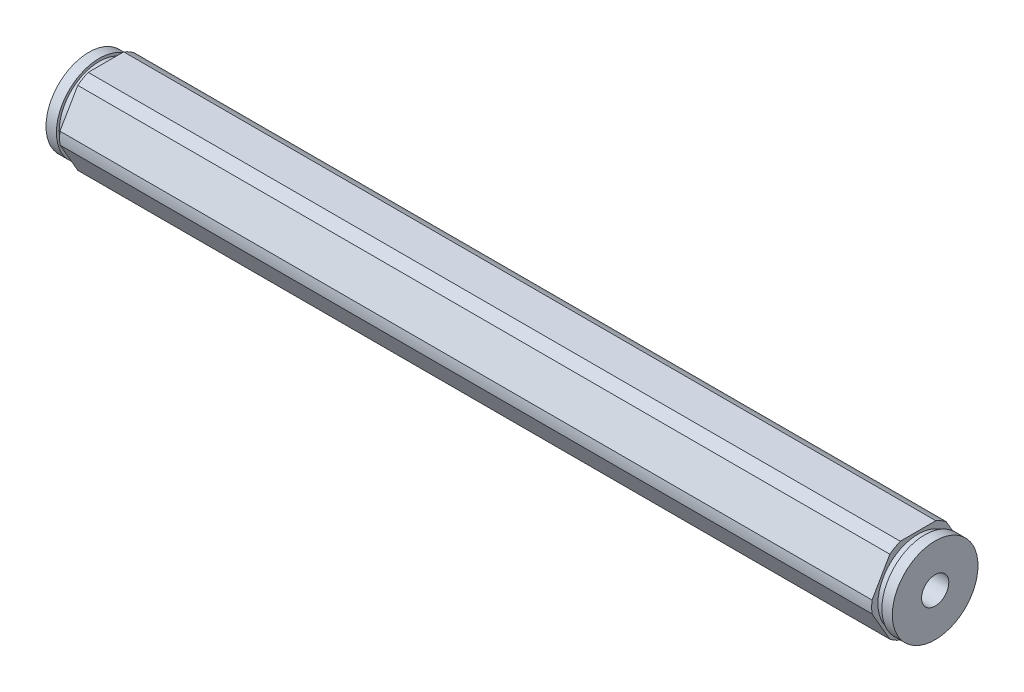
ISO-10303-21;
HEADER;
FILE_DESCRIPTION(('STEP AP214'),'2;1');
FILE_NAME('part.step','',(''),(''),'','','');
FILE_SCHEMA(('AUTOMOTIVE_DESIGN { 1 0 10303 214 1 1 1 1 }'));
ENDSEC;
DATA;
#1=APPLICATION_CONTEXT('core data for automotive mechanical design processes');
#2=APPLICATION_PROTOCOL_DEFINITION('international standard','automotive_design',2000,#1);
#3=PRODUCT_CONTEXT('',#1,'mechanical');
#4=PRODUCT('Part','Part','',(#3));
#5=PRODUCT_RELATED_PRODUCT_CATEGORY('part','',(#4));
#6=PRODUCT_DEFINITION_FORMATION('','',#4);
#7=PRODUCT_DEFINITION_CONTEXT('part definition',#1,'design');
#8=PRODUCT_DEFINITION('design','',#6,#7);
#9=PRODUCT_DEFINITION_SHAPE('','',#8);
#10=(LENGTH_UNIT() NAMED_UNIT(*) SI_UNIT(.MILLI.,.METRE.));
#11=(NAMED_UNIT(*) PLANE_ANGLE_UNIT() SI_UNIT($,.RADIAN.));
#12=(NAMED_UNIT(*) SI_UNIT($,.STERADIAN.) SOLID_ANGLE_UNIT());
#13=UNCERTAINTY_MEASURE_WITH_UNIT(LENGTH_MEASURE(1.E-05),#10,'distance_accuracy_value','');
#14=(GEOMETRIC_REPRESENTATION_CONTEXT(3) GLOBAL_UNCERTAINTY_ASSIGNED_CONTEXT((#13)) GLOBAL_UNIT_ASSIGNED_CONTEXT((#10,
#11,#12)) REPRESENTATION_CONTEXT('',''));
#15=CARTESIAN_POINT('',(0.,0.,0.));
#16=DIRECTION('',(0.,0.,1.));
#17=DIRECTION('',(1.,0.,0.));
#18=AXIS2_PLACEMENT_3D('',#15,#16,#17);
#19=CARTESIAN_POINT('',(62.738,-6.35,-3.66617420935412));
#20=DIRECTION('',(0.,0.5,0.866025403784439));
#21=DIRECTION('',(0.,-0.866025403784439,0.5));
#22=AXIS2_PLACEMENT_3D('',#19,#20,#21);
#23=PLANE('',#22);
#24=DIRECTION('',(1.,0.,0.));
#25=VECTOR('',#24,1.);
#26=CARTESIAN_POINT('',(-62.738,-5.45696050579321,-4.18177080173138));
#27=LINE('',#26,#25);
#28=CARTESIAN_POINT('',(-60.198,-5.45696050579321,-4.18177080173138));
#29=VERTEX_POINT('',#28);
#30=CARTESIAN_POINT('',(60.198,-5.45696050579321,-4.18177080173138));
#31=VERTEX_POINT('',#30);
#32=EDGE_CURVE('E254',#29,#31,#27,.T.);
#33=ORIENTED_EDGE('',*,*,#32,.F.);
#34=DIRECTION('',(0.,0.866025403784439,-0.5));
#35=VECTOR('',#34,1.);
#36=CARTESIAN_POINT('',(-60.198,-6.35,-3.66617420935412));
#37=LINE('',#36,#35);
#38=CARTESIAN_POINT('',(-60.198,-0.893039494206789,-6.81675182633099));
#39=VERTEX_POINT('',#38);
#40=EDGE_CURVE('E151',#29,#39,#37,.T.);
#41=ORIENTED_EDGE('',*,*,#40,.T.);
#42=DIRECTION('',(1.,0.,0.));
#43=VECTOR('',#42,1.);
#44=CARTESIAN_POINT('',(-62.738,-0.89303949420679,-6.81675182633099));
#45=LINE('',#44,#43);
#46=CARTESIAN_POINT('',(60.198,-0.89303949420679,-6.81675182633099));
#47=VERTEX_POINT('',#46);
#48=EDGE_CURVE('E60',#47,#39,#45,.F.);
#49=ORIENTED_EDGE('',*,*,#48,.F.);
#50=DIRECTION('',(0.,-0.866025403784439,0.5));
#51=VECTOR('',#50,1.);
#52=CARTESIAN_POINT('',(60.198,-6.35,-3.66617420935412));
#53=LINE('',#52,#51);
#54=EDGE_CURVE('E179',#47,#31,#53,.T.);
#55=ORIENTED_EDGE('',*,*,#54,.T.);
#56=EDGE_LOOP('',(#33,#41,#49,#55));
#57=FACE_BOUND('',#56,.T.);
#58=ADVANCED_FACE('F45',(#57),#23,.F.);
#59=CARTESIAN_POINT('',(62.738,0.,-7.33234841870825));
#60=DIRECTION('',(0.,-0.5,0.866025403784439));
#61=DIRECTION('',(0.,-0.866025403784439,-0.5));
#62=AXIS2_PLACEMENT_3D('',#59,#60,#61);
#63=PLANE('',#62);
#64=DIRECTION('',(1.,0.,0.));
#65=VECTOR('',#64,1.);
#66=CARTESIAN_POINT('',(-62.738,0.893039494206789,-6.81675182633099));
#67=LINE('',#66,#65);
#68=CARTESIAN_POINT('',(-60.198,0.893039494206789,-6.81675182633099));
#69=VERTEX_POINT('',#68);
#70=CARTESIAN_POINT('',(60.198,0.893039494206789,-6.81675182633099));
#71=VERTEX_POINT('',#70);
#72=EDGE_CURVE('E132',#69,#71,#67,.T.);
#73=ORIENTED_EDGE('',*,*,#72,.F.);
#74=DIRECTION('',(0.,0.866025403784439,0.5));
#75=VECTOR('',#74,1.);
#76=CARTESIAN_POINT('',(-60.198,0.,-7.33234841870825));
#77=LINE('',#76,#75);
#78=CARTESIAN_POINT('',(-60.198,5.45696050579321,-4.18177080173138));
#79=VERTEX_POINT('',#78);
#80=EDGE_CURVE('E144',#69,#79,#77,.T.);
#81=ORIENTED_EDGE('',*,*,#80,.T.);
#82=DIRECTION('',(1.,0.,0.));
#83=VECTOR('',#82,1.);
#84=CARTESIAN_POINT('',(-62.738,5.45696050579321,-4.18177080173138));
#85=LINE('',#84,#83);
#86=CARTESIAN_POINT('',(60.198,5.45696050579321,-4.18177080173138));
#87=VERTEX_POINT('',#86);
#88=EDGE_CURVE('E67',#87,#79,#85,.F.);
#89=ORIENTED_EDGE('',*,*,#88,.F.);
#90=DIRECTION('',(0.,-0.866025403784439,-0.5));
#91=VECTOR('',#90,1.);
#92=CARTESIAN_POINT('',(60.198,0.,-7.33234841870825));
#93=LINE('',#92,#91);
#94=EDGE_CURVE('E146',#87,#71,#93,.T.);
#95=ORIENTED_EDGE('',*,*,#94,.T.);
#96=EDGE_LOOP('',(#73,#81,#89,#95));
#97=FACE_BOUND('',#96,.T.);
#98=ADVANCED_FACE('F143',(#97),#63,.F.);
#99=CARTESIAN_POINT('',(62.738,6.35,-3.66617420935412));
#100=DIRECTION('',(0.,-1.,0.));
#101=DIRECTION('',(0.,0.,-1.));
#102=AXIS2_PLACEMENT_3D('',#99,#100,#101);
#103=PLANE('',#102);
#104=DIRECTION('',(1.,0.,0.));
#105=VECTOR('',#104,1.);
#106=CARTESIAN_POINT('',(-62.738,6.35,-2.63498102459961));
#107=LINE('',#106,#105);
#108=CARTESIAN_POINT('',(-60.198,6.35,-2.63498102459961));
#109=VERTEX_POINT('',#108);
#110=CARTESIAN_POINT('',(60.198,6.35,-2.63498102459961));
#111=VERTEX_POINT('',#110);
#112=EDGE_CURVE('E241',#109,#111,#107,.T.);
#113=ORIENTED_EDGE('',*,*,#112,.F.);
#114=DIRECTION('',(0.,0.,1.));
#115=VECTOR('',#114,1.);
#116=CARTESIAN_POINT('',(-60.198,6.35,-3.66617420935412));
#117=LINE('',#116,#115);
#118=CARTESIAN_POINT('',(-60.198,6.35,2.63498102459961));
#119=VERTEX_POINT('',#118);
#120=EDGE_CURVE('E152',#109,#119,#117,.T.);
#121=ORIENTED_EDGE('',*,*,#120,.T.);
#122=DIRECTION('',(1.,0.,0.));
#123=VECTOR('',#122,1.);
#124=CARTESIAN_POINT('',(-62.738,6.35,2.63498102459961));
#125=LINE('',#124,#123);
#126=CARTESIAN_POINT('',(60.198,6.35,2.63498102459961));
#127=VERTEX_POINT('',#126);
#128=EDGE_CURVE('E218',#127,#119,#125,.F.);
#129=ORIENTED_EDGE('',*,*,#128,.F.);
#130=DIRECTION('',(0.,0.,-1.));
#131=VECTOR('',#130,1.);
#132=CARTESIAN_POINT('',(60.198,6.35,-3.66617420935412));
#133=LINE('',#132,#131);
#134=EDGE_CURVE('E175',#127,#111,#133,.T.);
#135=ORIENTED_EDGE('',*,*,#134,.T.);
#136=EDGE_LOOP('',(#113,#121,#129,#135));
#137=FACE_BOUND('',#136,.T.);
#138=ADVANCED_FACE('F304',(#137),#103,.F.);
#139=CARTESIAN_POINT('',(62.738,6.35,3.66617420935412));
#140=DIRECTION('',(0.,-0.5,-0.866025403784439));
#141=DIRECTION('',(0.,0.866025403784439,-0.5));
#142=AXIS2_PLACEMENT_3D('',#139,#140,#141);
#143=PLANE('',#142);
#144=DIRECTION('',(1.,0.,0.));
#145=VECTOR('',#144,1.);
#146=CARTESIAN_POINT('',(-62.738,5.45696050579321,4.18177080173138));
#147=LINE('',#146,#145);
#148=CARTESIAN_POINT('',(-60.198,5.45696050579321,4.18177080173138));
#149=VERTEX_POINT('',#148);
#150=CARTESIAN_POINT('',(60.198,5.45696050579321,4.18177080173138));
#151=VERTEX_POINT('',#150);
#152=EDGE_CURVE('E215',#149,#151,#147,.T.);
#153=ORIENTED_EDGE('',*,*,#152,.F.);
#154=DIRECTION('',(0.,-0.866025403784439,0.5));
#155=VECTOR('',#154,1.);
#156=CARTESIAN_POINT('',(-60.198,6.35,3.66617420935412));
#157=LINE('',#156,#155);
#158=CARTESIAN_POINT('',(-60.198,0.893039494206796,6.81675182633099));
#159=VERTEX_POINT('',#158);
#160=EDGE_CURVE('E157',#149,#159,#157,.T.);
#161=ORIENTED_EDGE('',*,*,#160,.T.);
#162=DIRECTION('',(1.,0.,0.));
#163=VECTOR('',#162,1.);
#164=CARTESIAN_POINT('',(-62.738,0.893039494206798,6.81675182633099));
#165=LINE('',#164,#163);
#166=CARTESIAN_POINT('',(60.198,0.893039494206798,6.81675182633099));
#167=VERTEX_POINT('',#166);
#168=EDGE_CURVE('E245',#167,#159,#165,.F.);
#169=ORIENTED_EDGE('',*,*,#168,.F.);
#170=DIRECTION('',(0.,0.866025403784439,-0.5));
#171=VECTOR('',#170,1.);
#172=CARTESIAN_POINT('',(60.198,6.35,3.66617420935412));
#173=LINE('',#172,#171);
#174=EDGE_CURVE('E172',#167,#151,#173,.T.);
#175=ORIENTED_EDGE('',*,*,#174,.T.);
#176=EDGE_LOOP('',(#153,#161,#169,#175));
#177=FACE_BOUND('',#176,.T.);
#178=ADVANCED_FACE('F222',(#177),#143,.F.);
#179=CARTESIAN_POINT('',(62.738,0.,7.33234841870825));
#180=DIRECTION('',(0.,0.5,-0.866025403784439));
#181=DIRECTION('',(0.,0.866025403784439,0.5));
#182=AXIS2_PLACEMENT_3D('',#179,#180,#181);
#183=PLANE('',#182);
#184=DIRECTION('',(1.,0.,0.));
#185=VECTOR('',#184,1.);
#186=CARTESIAN_POINT('',(-62.738,-0.8930394942068,6.81675182633099));
#187=LINE('',#186,#185);
#188=CARTESIAN_POINT('',(-60.198,-0.893039494206797,6.81675182633099));
#189=VERTEX_POINT('',#188);
#190=CARTESIAN_POINT('',(60.198,-0.8930394942068,6.81675182633099));
#191=VERTEX_POINT('',#190);
#192=EDGE_CURVE('E247',#189,#191,#187,.T.);
#193=ORIENTED_EDGE('',*,*,#192,.F.);
#194=DIRECTION('',(0.,-0.866025403784439,-0.5));
#195=VECTOR('',#194,1.);
#196=CARTESIAN_POINT('',(-60.198,0.,7.33234841870825));
#197=LINE('',#196,#195);
#198=CARTESIAN_POINT('',(-60.198,-5.4569605057932,4.18177080173139));
#199=VERTEX_POINT('',#198);
#200=EDGE_CURVE('E227',#189,#199,#197,.T.);
#201=ORIENTED_EDGE('',*,*,#200,.T.);
#202=DIRECTION('',(1.,0.,0.));
#203=VECTOR('',#202,1.);
#204=CARTESIAN_POINT('',(-62.738,-5.4569605057932,4.18177080173139));
#205=LINE('',#204,#203);
#206=CARTESIAN_POINT('',(60.198,-5.4569605057932,4.18177080173139));
#207=VERTEX_POINT('',#206);
#208=EDGE_CURVE('E250',#207,#199,#205,.F.);
#209=ORIENTED_EDGE('',*,*,#208,.F.);
#210=DIRECTION('',(0.,0.866025403784439,0.5));
#211=VECTOR('',#210,1.);
#212=CARTESIAN_POINT('',(60.198,0.,7.33234841870825));
#213=LINE('',#212,#211);
#214=EDGE_CURVE('E169',#207,#191,#213,.T.);
#215=ORIENTED_EDGE('',*,*,#214,.T.);
#216=EDGE_LOOP('',(#193,#201,#209,#215));
#217=FACE_BOUND('',#216,.T.);
#218=ADVANCED_FACE('F323',(#217),#183,.F.);
#219=CARTESIAN_POINT('',(62.738,-6.35,3.66617420935413));
#220=DIRECTION('',(0.,1.,0.));
#221=DIRECTION('',(0.,0.,1.));
#222=AXIS2_PLACEMENT_3D('',#219,#220,#221);
#223=PLANE('',#222);
#224=DIRECTION('',(1.,0.,0.));
#225=VECTOR('',#224,1.);
#226=CARTESIAN_POINT('',(-62.738,-6.35,2.63498102459961));
#227=LINE('',#226,#225);
#228=CARTESIAN_POINT('',(-60.198,-6.35,2.63498102459961));
#229=VERTEX_POINT('',#228);
#230=CARTESIAN_POINT('',(60.198,-6.35,2.63498102459961));
#231=VERTEX_POINT('',#230);
#232=EDGE_CURVE('E198',#229,#231,#227,.T.);
#233=ORIENTED_EDGE('',*,*,#232,.F.);
#234=DIRECTION('',(0.,0.,-1.));
#235=VECTOR('',#234,1.);
#236=CARTESIAN_POINT('',(-60.198,-6.35,3.66617420935413));
#237=LINE('',#236,#235);
#238=CARTESIAN_POINT('',(-60.198,-6.35,-2.6349810245996));
#239=VERTEX_POINT('',#238);
#240=EDGE_CURVE('E139',#229,#239,#237,.T.);
#241=ORIENTED_EDGE('',*,*,#240,.T.);
#242=DIRECTION('',(1.,0.,0.));
#243=VECTOR('',#242,1.);
#244=CARTESIAN_POINT('',(-62.738,-6.35,-2.6349810245996));
#245=LINE('',#244,#243);
#246=CARTESIAN_POINT('',(60.198,-6.35,-2.6349810245996));
#247=VERTEX_POINT('',#246);
#248=EDGE_CURVE('E196',#247,#239,#245,.F.);
#249=ORIENTED_EDGE('',*,*,#248,.F.);
#250=DIRECTION('',(0.,0.,1.));
#251=VECTOR('',#250,1.);
#252=CARTESIAN_POINT('',(60.198,-6.35,3.66617420935413));
#253=LINE('',#252,#251);
#254=EDGE_CURVE('E185',#247,#231,#253,.T.);
#255=ORIENTED_EDGE('',*,*,#254,.T.);
#256=EDGE_LOOP('',(#233,#241,#249,#255));
#257=FACE_BOUND('',#256,.T.);
#258=ADVANCED_FACE('F195',(#257),#223,.F.);
#259=CARTESIAN_POINT('',(60.198,0.,8.89));
#260=DIRECTION('',(-1.,0.,0.));
#261=DIRECTION('',(0.,0.,1.));
#262=AXIS2_PLACEMENT_3D('',#259,#260,#261);
#263=PLANE('',#262);
#264=CARTESIAN_POINT('',(60.198,0.,0.));
#265=DIRECTION('',(-1.,0.,0.));
#266=DIRECTION('',(0.,0.,1.));
#267=AXIS2_PLACEMENT_3D('',#264,#265,#266);
#268=CIRCLE('',#267,5.9436);
#269=CARTESIAN_POINT('',(60.198,0.,5.9436));
#270=VERTEX_POINT('',#269);
#271=EDGE_CURVE('E166',#270,#270,#268,.T.);
#272=ORIENTED_EDGE('',*,*,#271,.T.);
#273=EDGE_LOOP('',(#272));
#274=FACE_BOUND('',#273,.T.);
#275=CARTESIAN_POINT('',(60.198,0.,0.));
#276=DIRECTION('',(-1.,0.,0.));
#277=DIRECTION('',(0.,0.,1.));
#278=AXIS2_PLACEMENT_3D('',#275,#276,#277);
#279=CIRCLE('',#278,6.875);
#280=EDGE_CURVE('E243',#151,#127,#279,.T.);
#281=ORIENTED_EDGE('',*,*,#280,.F.);
#282=ORIENTED_EDGE('',*,*,#174,.F.);
#283=EDGE_CURVE('E225',#191,#167,#279,.T.);
#284=ORIENTED_EDGE('',*,*,#283,.F.);
#285=ORIENTED_EDGE('',*,*,#214,.F.);
#286=EDGE_CURVE('E249',#231,#207,#279,.T.);
#287=ORIENTED_EDGE('',*,*,#286,.F.);
#288=ORIENTED_EDGE('',*,*,#254,.F.);
#289=EDGE_CURVE('E253',#31,#247,#279,.T.);
#290=ORIENTED_EDGE('',*,*,#289,.F.);
#291=ORIENTED_EDGE('',*,*,#54,.F.);
#292=EDGE_CURVE('E257',#71,#47,#279,.T.);
#293=ORIENTED_EDGE('',*,*,#292,.F.);
#294=ORIENTED_EDGE('',*,*,#94,.F.);
#295=EDGE_CURVE('E239',#111,#87,#279,.T.);
#296=ORIENTED_EDGE('',*,*,#295,.F.);
#297=ORIENTED_EDGE('',*,*,#134,.F.);
#298=EDGE_LOOP('',(#281,#282,#284,#285,#287,#288,#290,#291,#293,#294,#296,#297));
#299=FACE_BOUND('',#298,.T.);
#300=ADVANCED_FACE('F309',(#274,#299),#263,.F.);
#301=CARTESIAN_POINT('',(-60.198,0.,8.89));
#302=DIRECTION('',(1.,0.,0.));
#303=DIRECTION('',(0.,0.,1.));
#304=AXIS2_PLACEMENT_3D('',#301,#302,#303);
#305=PLANE('',#304);
#306=CARTESIAN_POINT('',(-60.198,0.,0.));
#307=DIRECTION('',(-1.,0.,0.));
#308=DIRECTION('',(0.,0.,1.));
#309=AXIS2_PLACEMENT_3D('',#306,#307,#308);
#310=CIRCLE('',#309,5.9436);
#311=CARTESIAN_POINT('',(-60.198,0.,5.9436));
#312=VERTEX_POINT('',#311);
#313=EDGE_CURVE('E228',#312,#312,#310,.T.);
#314=ORIENTED_EDGE('',*,*,#313,.F.);
#315=EDGE_LOOP('',(#314));
#316=FACE_BOUND('',#315,.T.);
#317=CARTESIAN_POINT('',(-60.198,0.,0.));
#318=DIRECTION('',(1.,0.,0.));
#319=DIRECTION('',(0.,0.,-1.));
#320=AXIS2_PLACEMENT_3D('',#317,#318,#319);
#321=CIRCLE('',#320,6.875);
#322=EDGE_CURVE('E12',#79,#109,#321,.T.);
#323=ORIENTED_EDGE('',*,*,#322,.F.);
#324=ORIENTED_EDGE('',*,*,#80,.F.);
#325=EDGE_CURVE('E48',#39,#69,#321,.T.);
#326=ORIENTED_EDGE('',*,*,#325,.F.);
#327=ORIENTED_EDGE('',*,*,#40,.F.);
#328=EDGE_CURVE('E138',#239,#29,#321,.T.);
#329=ORIENTED_EDGE('',*,*,#328,.F.);
#330=ORIENTED_EDGE('',*,*,#240,.F.);
#331=EDGE_CURVE('E202',#199,#229,#321,.T.);
#332=ORIENTED_EDGE('',*,*,#331,.F.);
#333=ORIENTED_EDGE('',*,*,#200,.F.);
#334=EDGE_CURVE('E206',#159,#189,#321,.T.);
#335=ORIENTED_EDGE('',*,*,#334,.F.);
#336=ORIENTED_EDGE('',*,*,#160,.F.);
#337=EDGE_CURVE('E53',#119,#149,#321,.T.);
#338=ORIENTED_EDGE('',*,*,#337,.F.);
#339=ORIENTED_EDGE('',*,*,#120,.F.);
#340=EDGE_LOOP('',(#323,#324,#326,#327,#329,#330,#332,#333,#335,#336,#338,#339));
#341=FACE_BOUND('',#340,.T.);
#342=ADVANCED_FACE('F149',(#316,#341),#305,.F.);
#343=CARTESIAN_POINT('',(0.,0.,0.));
#344=DIRECTION('',(-1.,0.,0.));
#345=DIRECTION('',(0.,0.,1.));
#346=AXIS2_PLACEMENT_3D('',#343,#344,#345);
#347=CYLINDRICAL_SURFACE('',#346,6.35);
#348=CARTESIAN_POINT('',(62.738,0.,0.));
#349=DIRECTION('',(1.,0.,0.));
#350=DIRECTION('',(0.,0.,-1.));
#351=AXIS2_PLACEMENT_3D('',#348,#349,#350);
#352=CIRCLE('',#351,6.35);
#353=CARTESIAN_POINT('',(62.738,0.,-6.35));
#354=VERTEX_POINT('',#353);
#355=EDGE_CURVE('E182',#354,#354,#352,.F.);
#356=ORIENTED_EDGE('',*,*,#355,.T.);
#357=EDGE_LOOP('',(#356));
#358=FACE_BOUND('',#357,.T.);
#359=CARTESIAN_POINT('',(61.1886,0.,0.));
#360=DIRECTION('',(-1.,0.,0.));
#361=DIRECTION('',(0.,0.,1.));
#362=AXIS2_PLACEMENT_3D('',#359,#360,#361);
#363=CIRCLE('',#362,6.35);
#364=CARTESIAN_POINT('',(61.1886,0.,6.35));
#365=VERTEX_POINT('',#364);
#366=EDGE_CURVE('E154',#365,#365,#363,.T.);
#367=ORIENTED_EDGE('',*,*,#366,.F.);
#368=EDGE_LOOP('',(#367));
#369=FACE_BOUND('',#368,.T.);
#370=ADVANCED_FACE('F283',(#358,#369),#347,.T.);
#371=CARTESIAN_POINT('',(0.,0.,0.));
#372=DIRECTION('',(-1.,0.,0.));
#373=DIRECTION('',(0.,0.,1.));
#374=AXIS2_PLACEMENT_3D('',#371,#372,#373);
#375=CYLINDRICAL_SURFACE('',#374,5.9436);
#376=ORIENTED_EDGE('',*,*,#271,.F.);
#377=EDGE_LOOP('',(#376));
#378=FACE_BOUND('',#377,.T.);
#379=CARTESIAN_POINT('',(61.1886,0.,0.));
#380=DIRECTION('',(-1.,0.,0.));
#381=DIRECTION('',(0.,0.,1.));
#382=AXIS2_PLACEMENT_3D('',#379,#380,#381);
#383=CIRCLE('',#382,5.9436);
#384=CARTESIAN_POINT('',(61.1886,0.,5.9436));
#385=VERTEX_POINT('',#384);
#386=EDGE_CURVE('E163',#385,#385,#383,.T.);
#387=ORIENTED_EDGE('',*,*,#386,.T.);
#388=EDGE_LOOP('',(#387));
#389=FACE_BOUND('',#388,.T.);
#390=ADVANCED_FACE('F286',(#378,#389),#375,.T.);
#391=CARTESIAN_POINT('',(61.1886,0.,5.9436));
#392=DIRECTION('',(1.,0.,0.));
#393=DIRECTION('',(0.,0.,-1.));
#394=AXIS2_PLACEMENT_3D('',#391,#392,#393);
#395=PLANE('',#394);
#396=ORIENTED_EDGE('',*,*,#386,.F.);
#397=EDGE_LOOP('',(#396));
#398=FACE_BOUND('',#397,.T.);
#399=ORIENTED_EDGE('',*,*,#366,.T.);
#400=EDGE_LOOP('',(#399));
#401=FACE_BOUND('',#400,.T.);
#402=ADVANCED_FACE('F279',(#398,#401),#395,.F.);
#403=CARTESIAN_POINT('',(62.738,0.,0.));
#404=DIRECTION('',(1.,0.,0.));
#405=DIRECTION('',(0.,0.,-1.));
#406=AXIS2_PLACEMENT_3D('',#403,#404,#405);
#407=PLANE('',#406);
#408=CARTESIAN_POINT('',(62.738,0.,0.));
#409=DIRECTION('',(1.,0.,0.));
#410=DIRECTION('',(0.,0.,-1.));
#411=AXIS2_PLACEMENT_3D('',#408,#409,#410);
#412=CIRCLE('',#411,2.0193);
#413=CARTESIAN_POINT('',(62.738,0.,-2.0193));
#414=VERTEX_POINT('',#413);
#415=EDGE_CURVE('E260',#414,#414,#412,.T.);
#416=ORIENTED_EDGE('',*,*,#415,.F.);
#417=EDGE_LOOP('',(#416));
#418=FACE_BOUND('',#417,.T.);
#419=ORIENTED_EDGE('',*,*,#355,.F.);
#420=EDGE_LOOP('',(#419));
#421=FACE_BOUND('',#420,.T.);
#422=ADVANCED_FACE('F275',(#418,#421),#407,.T.);
#423=CARTESIAN_POINT('',(0.,0.,0.));
#424=DIRECTION('',(1.,0.,0.));
#425=DIRECTION('',(0.,0.,1.));
#426=AXIS2_PLACEMENT_3D('',#423,#424,#425);
#427=CYLINDRICAL_SURFACE('',#426,6.35);
#428=CARTESIAN_POINT('',(-62.738,0.,0.));
#429=DIRECTION('',(1.,0.,0.));
#430=DIRECTION('',(0.,0.,-1.));
#431=AXIS2_PLACEMENT_3D('',#428,#429,#430);
#432=CIRCLE('',#431,6.35);
#433=CARTESIAN_POINT('',(-62.738,0.,-6.35));
#434=VERTEX_POINT('',#433);
#435=EDGE_CURVE('E188',#434,#434,#432,.F.);
#436=ORIENTED_EDGE('',*,*,#435,.F.);
#437=EDGE_LOOP('',(#436));
#438=FACE_BOUND('',#437,.T.);
#439=CARTESIAN_POINT('',(-61.1886,0.,0.));
#440=DIRECTION('',(-1.,0.,0.));
#441=DIRECTION('',(0.,0.,1.));
#442=AXIS2_PLACEMENT_3D('',#439,#440,#441);
#443=CIRCLE('',#442,6.35);
#444=CARTESIAN_POINT('',(-61.1886,0.,6.35));
#445=VERTEX_POINT('',#444);
#446=EDGE_CURVE('E236',#445,#445,#443,.T.);
#447=ORIENTED_EDGE('',*,*,#446,.T.);
#448=EDGE_LOOP('',(#447));
#449=FACE_BOUND('',#448,.T.);
#450=ADVANCED_FACE('F278',(#438,#449),#427,.T.);
#451=CARTESIAN_POINT('',(0.,0.,0.));
#452=DIRECTION('',(1.,0.,0.));
#453=DIRECTION('',(0.,0.,1.));
#454=AXIS2_PLACEMENT_3D('',#451,#452,#453);
#455=CYLINDRICAL_SURFACE('',#454,5.9436);
#456=ORIENTED_EDGE('',*,*,#313,.T.);
#457=EDGE_LOOP('',(#456));
#458=FACE_BOUND('',#457,.T.);
#459=CARTESIAN_POINT('',(-61.1886,0.,0.));
#460=DIRECTION('',(-1.,0.,0.));
#461=DIRECTION('',(0.,0.,1.));
#462=AXIS2_PLACEMENT_3D('',#459,#460,#461);
#463=CIRCLE('',#462,5.9436);
#464=CARTESIAN_POINT('',(-61.1886,0.,5.9436));
#465=VERTEX_POINT('',#464);
#466=EDGE_CURVE('E233',#465,#465,#463,.T.);
#467=ORIENTED_EDGE('',*,*,#466,.F.);
#468=EDGE_LOOP('',(#467));
#469=FACE_BOUND('',#468,.T.);
#470=ADVANCED_FACE('F347',(#458,#469),#455,.T.);
#471=CARTESIAN_POINT('',(-61.1886,0.,5.9436));
#472=DIRECTION('',(-1.,0.,0.));
#473=DIRECTION('',(0.,0.,-1.));
#474=AXIS2_PLACEMENT_3D('',#471,#472,#473);
#475=PLANE('',#474);
#476=ORIENTED_EDGE('',*,*,#466,.T.);
#477=EDGE_LOOP('',(#476));
#478=FACE_BOUND('',#477,.T.);
#479=ORIENTED_EDGE('',*,*,#446,.F.);
#480=EDGE_LOOP('',(#479));
#481=FACE_BOUND('',#480,.T.);
#482=ADVANCED_FACE('F332',(#478,#481),#475,.F.);
#483=CARTESIAN_POINT('',(-62.738,0.,0.));
#484=DIRECTION('',(1.,0.,0.));
#485=DIRECTION('',(0.,0.,-1.));
#486=AXIS2_PLACEMENT_3D('',#483,#484,#485);
#487=PLANE('',#486);
#488=CARTESIAN_POINT('',(-62.738,0.,0.));
#489=DIRECTION('',(1.,0.,0.));
#490=DIRECTION('',(0.,0.,-1.));
#491=AXIS2_PLACEMENT_3D('',#488,#489,#490);
#492=CIRCLE('',#491,2.0193);
#493=CARTESIAN_POINT('',(-62.738,0.,-2.0193));
#494=VERTEX_POINT('',#493);
#495=EDGE_CURVE('E147',#494,#494,#492,.T.);
#496=ORIENTED_EDGE('',*,*,#495,.T.);
#497=EDGE_LOOP('',(#496));
#498=FACE_BOUND('',#497,.T.);
#499=ORIENTED_EDGE('',*,*,#435,.T.);
#500=EDGE_LOOP('',(#499));
#501=FACE_BOUND('',#500,.T.);
#502=ADVANCED_FACE('F266',(#498,#501),#487,.F.);
#503=CARTESIAN_POINT('',(-62.738,0.,0.));
#504=DIRECTION('',(1.,0.,0.));
#505=DIRECTION('',(0.,0.,-1.));
#506=AXIS2_PLACEMENT_3D('',#503,#504,#505);
#507=CYLINDRICAL_SURFACE('',#506,2.0193);
#508=ORIENTED_EDGE('',*,*,#495,.F.);
#509=EDGE_LOOP('',(#508));
#510=FACE_BOUND('',#509,.T.);
#511=ORIENTED_EDGE('',*,*,#415,.T.);
#512=EDGE_LOOP('',(#511));
#513=FACE_BOUND('',#512,.T.);
#514=ADVANCED_FACE('F269',(#510,#513),#507,.F.);
#515=CARTESIAN_POINT('',(-62.738,0.,0.));
#516=DIRECTION('',(1.,0.,0.));
#517=DIRECTION('',(0.,0.,-1.));
#518=AXIS2_PLACEMENT_3D('',#515,#516,#517);
#519=CYLINDRICAL_SURFACE('',#518,6.875);
#520=ORIENTED_EDGE('',*,*,#292,.T.);
#521=ORIENTED_EDGE('',*,*,#48,.T.);
#522=ORIENTED_EDGE('',*,*,#325,.T.);
#523=ORIENTED_EDGE('',*,*,#72,.T.);
#524=EDGE_LOOP('',(#520,#521,#522,#523));
#525=FACE_BOUND('',#524,.T.);
#526=ADVANCED_FACE('F131',(#525),#519,.T.);
#527=ORIENTED_EDGE('',*,*,#289,.T.);
#528=ORIENTED_EDGE('',*,*,#248,.T.);
#529=ORIENTED_EDGE('',*,*,#328,.T.);
#530=ORIENTED_EDGE('',*,*,#32,.T.);
#531=EDGE_LOOP('',(#527,#528,#529,#530));
#532=FACE_BOUND('',#531,.T.);
#533=ADVANCED_FACE('F307',(#532),#519,.T.);
#534=ORIENTED_EDGE('',*,*,#286,.T.);
#535=ORIENTED_EDGE('',*,*,#208,.T.);
#536=ORIENTED_EDGE('',*,*,#331,.T.);
#537=ORIENTED_EDGE('',*,*,#232,.T.);
#538=EDGE_LOOP('',(#534,#535,#536,#537));
#539=FACE_BOUND('',#538,.T.);
#540=ADVANCED_FACE('F366',(#539),#519,.T.);
#541=ORIENTED_EDGE('',*,*,#283,.T.);
#542=ORIENTED_EDGE('',*,*,#168,.T.);
#543=ORIENTED_EDGE('',*,*,#334,.T.);
#544=ORIENTED_EDGE('',*,*,#192,.T.);
#545=EDGE_LOOP('',(#541,#542,#543,#544));
#546=FACE_BOUND('',#545,.T.);
#547=ADVANCED_FACE('F361',(#546),#519,.T.);
#548=ORIENTED_EDGE('',*,*,#280,.T.);
#549=ORIENTED_EDGE('',*,*,#128,.T.);
#550=ORIENTED_EDGE('',*,*,#337,.T.);
#551=ORIENTED_EDGE('',*,*,#152,.T.);
#552=EDGE_LOOP('',(#548,#549,#550,#551));
#553=FACE_BOUND('',#552,.T.);
#554=ADVANCED_FACE('F214',(#553),#519,.T.);
#555=ORIENTED_EDGE('',*,*,#295,.T.);
#556=ORIENTED_EDGE('',*,*,#88,.T.);
#557=ORIENTED_EDGE('',*,*,#322,.T.);
#558=ORIENTED_EDGE('',*,*,#112,.T.);
#559=EDGE_LOOP('',(#555,#556,#557,#558));
#560=FACE_BOUND('',#559,.T.);
#561=ADVANCED_FACE('F314',(#560),#519,.T.);
#562=CLOSED_SHELL('',(#58,#98,#138,#178,#218,#258,#300,#342,#370,#390,#402,#422,#450,#470,#482,
#502,#514,#526,#533,#540,#547,#554,#561));
#563=MANIFOLD_SOLID_BREP('B2',#562);
#564=ADVANCED_BREP_SHAPE_REPRESENTATION('',(#18,#563),#14);
#565=SHAPE_DEFINITION_REPRESENTATION(#9,#564);
ENDSEC;
END-ISO-10303-21;
